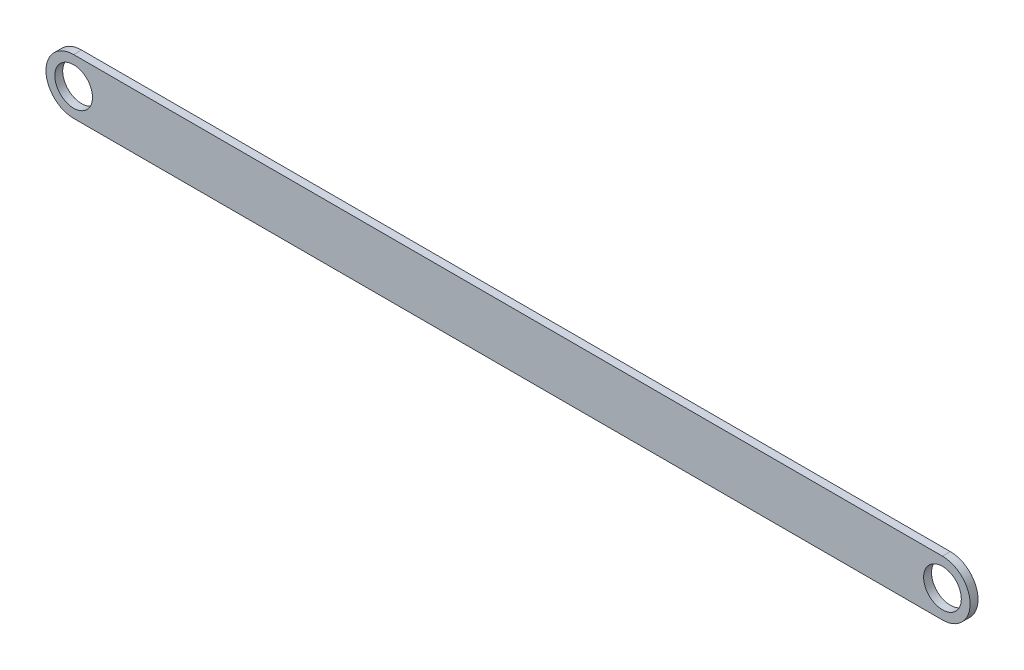
ISO-10303-21;
HEADER;
FILE_DESCRIPTION(('STEP AP214'),'2;1');
FILE_NAME('part.step','',(''),(''),'','','');
FILE_SCHEMA(('AUTOMOTIVE_DESIGN { 1 0 10303 214 1 1 1 1 }'));
ENDSEC;
DATA;
#1=APPLICATION_CONTEXT('core data for automotive mechanical design processes');
#2=APPLICATION_PROTOCOL_DEFINITION('international standard','automotive_design',2000,#1);
#3=PRODUCT_CONTEXT('',#1,'mechanical');
#4=PRODUCT('Part','Part','',(#3));
#5=PRODUCT_RELATED_PRODUCT_CATEGORY('part','',(#4));
#6=PRODUCT_DEFINITION_FORMATION('','',#4);
#7=PRODUCT_DEFINITION_CONTEXT('part definition',#1,'design');
#8=PRODUCT_DEFINITION('design','',#6,#7);
#9=PRODUCT_DEFINITION_SHAPE('','',#8);
#10=(LENGTH_UNIT() NAMED_UNIT(*) SI_UNIT(.MILLI.,.METRE.));
#11=(NAMED_UNIT(*) PLANE_ANGLE_UNIT() SI_UNIT($,.RADIAN.));
#12=(NAMED_UNIT(*) SI_UNIT($,.STERADIAN.) SOLID_ANGLE_UNIT());
#13=UNCERTAINTY_MEASURE_WITH_UNIT(LENGTH_MEASURE(1.E-05),#10,'distance_accuracy_value','');
#14=(GEOMETRIC_REPRESENTATION_CONTEXT(3) GLOBAL_UNCERTAINTY_ASSIGNED_CONTEXT((#13)) GLOBAL_UNIT_ASSIGNED_CONTEXT((#10,
#11,#12)) REPRESENTATION_CONTEXT('',''));
#15=CARTESIAN_POINT('',(0.,0.,0.));
#16=DIRECTION('',(0.,0.,1.));
#17=DIRECTION('',(1.,0.,0.));
#18=AXIS2_PLACEMENT_3D('',#15,#16,#17);
#19=CARTESIAN_POINT('',(0.,0.,4.));
#20=DIRECTION('',(0.,0.,1.));
#21=DIRECTION('',(1.,0.,0.));
#22=AXIS2_PLACEMENT_3D('',#19,#20,#21);
#23=PLANE('',#22);
#24=CARTESIAN_POINT('',(0.,0.,4.));
#25=DIRECTION('',(0.,0.,1.));
#26=DIRECTION('',(1.,0.,0.));
#27=AXIS2_PLACEMENT_3D('',#24,#25,#26);
#28=CIRCLE('',#27,9.54);
#29=CARTESIAN_POINT('',(9.54,0.,4.));
#30=VERTEX_POINT('',#29);
#31=EDGE_CURVE('E112',#30,#30,#28,.T.);
#32=ORIENTED_EDGE('',*,*,#31,.F.);
#33=EDGE_LOOP('',(#32));
#34=FACE_BOUND('',#33,.T.);
#35=CARTESIAN_POINT('',(0.,0.,4.));
#36=DIRECTION('',(0.,0.,1.));
#37=DIRECTION('',(1.,0.,0.));
#38=AXIS2_PLACEMENT_3D('',#35,#36,#37);
#39=CIRCLE('',#38,14.);
#40=CARTESIAN_POINT('',(0.,14.,4.));
#41=VERTEX_POINT('',#40);
#42=CARTESIAN_POINT('',(0.,-14.,4.));
#43=VERTEX_POINT('',#42);
#44=EDGE_CURVE('E92',#41,#43,#39,.T.);
#45=ORIENTED_EDGE('',*,*,#44,.T.);
#46=DIRECTION('',(1.,0.,0.));
#47=VECTOR('',#46,1.);
#48=CARTESIAN_POINT('',(440.,-14.,4.));
#49=LINE('',#48,#47);
#50=CARTESIAN_POINT('',(440.,-14.,4.));
#51=VERTEX_POINT('',#50);
#52=EDGE_CURVE('E87',#43,#51,#49,.T.);
#53=ORIENTED_EDGE('',*,*,#52,.T.);
#54=CARTESIAN_POINT('',(440.,0.,4.));
#55=DIRECTION('',(0.,0.,1.));
#56=DIRECTION('',(-1.,0.,0.));
#57=AXIS2_PLACEMENT_3D('',#54,#55,#56);
#58=CIRCLE('',#57,14.);
#59=CARTESIAN_POINT('',(440.,14.,4.));
#60=VERTEX_POINT('',#59);
#61=EDGE_CURVE('E90',#51,#60,#58,.T.);
#62=ORIENTED_EDGE('',*,*,#61,.T.);
#63=DIRECTION('',(-1.,0.,0.));
#64=VECTOR('',#63,1.);
#65=CARTESIAN_POINT('',(0.,14.,4.));
#66=LINE('',#65,#64);
#67=EDGE_CURVE('E57',#60,#41,#66,.T.);
#68=ORIENTED_EDGE('',*,*,#67,.T.);
#69=EDGE_LOOP('',(#45,#53,#62,#68));
#70=FACE_BOUND('',#69,.T.);
#71=CARTESIAN_POINT('',(440.,0.,4.));
#72=DIRECTION('',(0.,0.,1.));
#73=DIRECTION('',(1.,0.,0.));
#74=AXIS2_PLACEMENT_3D('',#71,#72,#73);
#75=CIRCLE('',#74,9.53999999999999);
#76=CARTESIAN_POINT('',(449.54,0.,4.));
#77=VERTEX_POINT('',#76);
#78=EDGE_CURVE('E134',#77,#77,#75,.T.);
#79=ORIENTED_EDGE('',*,*,#78,.F.);
#80=EDGE_LOOP('',(#79));
#81=FACE_BOUND('',#80,.T.);
#82=ADVANCED_FACE('F39',(#34,#70,#81),#23,.T.);
#83=CARTESIAN_POINT('',(0.,0.,0.));
#84=DIRECTION('',(0.,0.,1.));
#85=DIRECTION('',(1.,0.,0.));
#86=AXIS2_PLACEMENT_3D('',#83,#84,#85);
#87=PLANE('',#86);
#88=CARTESIAN_POINT('',(0.,0.,0.));
#89=DIRECTION('',(0.,0.,1.));
#90=DIRECTION('',(1.,0.,0.));
#91=AXIS2_PLACEMENT_3D('',#88,#89,#90);
#92=CIRCLE('',#91,14.);
#93=CARTESIAN_POINT('',(0.,14.,0.));
#94=VERTEX_POINT('',#93);
#95=CARTESIAN_POINT('',(0.,-14.,0.));
#96=VERTEX_POINT('',#95);
#97=EDGE_CURVE('E108',#94,#96,#92,.T.);
#98=ORIENTED_EDGE('',*,*,#97,.F.);
#99=DIRECTION('',(-1.,0.,0.));
#100=VECTOR('',#99,1.);
#101=CARTESIAN_POINT('',(0.,14.,0.));
#102=LINE('',#101,#100);
#103=CARTESIAN_POINT('',(440.,14.,0.));
#104=VERTEX_POINT('',#103);
#105=EDGE_CURVE('E80',#104,#94,#102,.T.);
#106=ORIENTED_EDGE('',*,*,#105,.F.);
#107=CARTESIAN_POINT('',(440.,0.,0.));
#108=DIRECTION('',(0.,0.,1.));
#109=DIRECTION('',(-1.,0.,0.));
#110=AXIS2_PLACEMENT_3D('',#107,#108,#109);
#111=CIRCLE('',#110,14.);
#112=CARTESIAN_POINT('',(440.,-14.,0.));
#113=VERTEX_POINT('',#112);
#114=EDGE_CURVE('E74',#113,#104,#111,.T.);
#115=ORIENTED_EDGE('',*,*,#114,.F.);
#116=DIRECTION('',(1.,0.,0.));
#117=VECTOR('',#116,1.);
#118=CARTESIAN_POINT('',(440.,-14.,0.));
#119=LINE('',#118,#117);
#120=EDGE_CURVE('E97',#96,#113,#119,.T.);
#121=ORIENTED_EDGE('',*,*,#120,.F.);
#122=EDGE_LOOP('',(#98,#106,#115,#121));
#123=FACE_BOUND('',#122,.T.);
#124=CARTESIAN_POINT('',(0.,0.,0.));
#125=DIRECTION('',(0.,0.,1.));
#126=DIRECTION('',(1.,0.,0.));
#127=AXIS2_PLACEMENT_3D('',#124,#125,#126);
#128=CIRCLE('',#127,9.54);
#129=CARTESIAN_POINT('',(9.54,0.,0.));
#130=VERTEX_POINT('',#129);
#131=EDGE_CURVE('E130',#130,#130,#128,.T.);
#132=ORIENTED_EDGE('',*,*,#131,.T.);
#133=EDGE_LOOP('',(#132));
#134=FACE_BOUND('',#133,.T.);
#135=CARTESIAN_POINT('',(440.,0.,0.));
#136=DIRECTION('',(0.,0.,1.));
#137=DIRECTION('',(1.,0.,0.));
#138=AXIS2_PLACEMENT_3D('',#135,#136,#137);
#139=CIRCLE('',#138,9.53999999999999);
#140=CARTESIAN_POINT('',(449.54,0.,0.));
#141=VERTEX_POINT('',#140);
#142=EDGE_CURVE('E138',#141,#141,#139,.T.);
#143=ORIENTED_EDGE('',*,*,#142,.T.);
#144=EDGE_LOOP('',(#143));
#145=FACE_BOUND('',#144,.T.);
#146=ADVANCED_FACE('F125',(#123,#134,#145),#87,.F.);
#147=CARTESIAN_POINT('',(0.,0.,4.));
#148=DIRECTION('',(0.,0.,-1.));
#149=DIRECTION('',(-1.,0.,0.));
#150=AXIS2_PLACEMENT_3D('',#147,#148,#149);
#151=CYLINDRICAL_SURFACE('',#150,14.);
#152=ORIENTED_EDGE('',*,*,#97,.T.);
#153=DIRECTION('',(0.,0.,-1.));
#154=VECTOR('',#153,1.);
#155=CARTESIAN_POINT('',(0.,-14.,4.));
#156=LINE('',#155,#154);
#157=EDGE_CURVE('E11',#43,#96,#156,.T.);
#158=ORIENTED_EDGE('',*,*,#157,.F.);
#159=ORIENTED_EDGE('',*,*,#44,.F.);
#160=DIRECTION('',(0.,0.,-1.));
#161=VECTOR('',#160,1.);
#162=CARTESIAN_POINT('',(0.,14.,4.));
#163=LINE('',#162,#161);
#164=EDGE_CURVE('E104',#41,#94,#163,.T.);
#165=ORIENTED_EDGE('',*,*,#164,.T.);
#166=EDGE_LOOP('',(#152,#158,#159,#165));
#167=FACE_BOUND('',#166,.T.);
#168=ADVANCED_FACE('F41',(#167),#151,.T.);
#169=CARTESIAN_POINT('',(440.,-14.,4.));
#170=DIRECTION('',(0.,1.,0.));
#171=DIRECTION('',(-1.,0.,0.));
#172=AXIS2_PLACEMENT_3D('',#169,#170,#171);
#173=PLANE('',#172);
#174=ORIENTED_EDGE('',*,*,#120,.T.);
#175=DIRECTION('',(0.,0.,-1.));
#176=VECTOR('',#175,1.);
#177=CARTESIAN_POINT('',(440.,-14.,4.));
#178=LINE('',#177,#176);
#179=EDGE_CURVE('E49',#51,#113,#178,.T.);
#180=ORIENTED_EDGE('',*,*,#179,.F.);
#181=ORIENTED_EDGE('',*,*,#52,.F.);
#182=ORIENTED_EDGE('',*,*,#157,.T.);
#183=EDGE_LOOP('',(#174,#180,#181,#182));
#184=FACE_BOUND('',#183,.T.);
#185=ADVANCED_FACE('F96',(#184),#173,.F.);
#186=CARTESIAN_POINT('',(440.,0.,4.));
#187=DIRECTION('',(0.,0.,-1.));
#188=DIRECTION('',(-1.,0.,0.));
#189=AXIS2_PLACEMENT_3D('',#186,#187,#188);
#190=CYLINDRICAL_SURFACE('',#189,14.);
#191=ORIENTED_EDGE('',*,*,#114,.T.);
#192=DIRECTION('',(0.,0.,-1.));
#193=VECTOR('',#192,1.);
#194=CARTESIAN_POINT('',(440.,14.,4.));
#195=LINE('',#194,#193);
#196=EDGE_CURVE('E99',#60,#104,#195,.T.);
#197=ORIENTED_EDGE('',*,*,#196,.F.);
#198=ORIENTED_EDGE('',*,*,#61,.F.);
#199=ORIENTED_EDGE('',*,*,#179,.T.);
#200=EDGE_LOOP('',(#191,#197,#198,#199));
#201=FACE_BOUND('',#200,.T.);
#202=ADVANCED_FACE('F100',(#201),#190,.T.);
#203=CARTESIAN_POINT('',(0.,14.,4.));
#204=DIRECTION('',(0.,-1.,0.));
#205=DIRECTION('',(1.,0.,0.));
#206=AXIS2_PLACEMENT_3D('',#203,#204,#205);
#207=PLANE('',#206);
#208=ORIENTED_EDGE('',*,*,#105,.T.);
#209=ORIENTED_EDGE('',*,*,#164,.F.);
#210=ORIENTED_EDGE('',*,*,#67,.F.);
#211=ORIENTED_EDGE('',*,*,#196,.T.);
#212=EDGE_LOOP('',(#208,#209,#210,#211));
#213=FACE_BOUND('',#212,.T.);
#214=ADVANCED_FACE('F122',(#213),#207,.F.);
#215=CARTESIAN_POINT('',(0.,0.,4.));
#216=DIRECTION('',(0.,0.,-1.));
#217=DIRECTION('',(-1.,0.,0.));
#218=AXIS2_PLACEMENT_3D('',#215,#216,#217);
#219=CYLINDRICAL_SURFACE('',#218,9.54);
#220=ORIENTED_EDGE('',*,*,#31,.T.);
#221=EDGE_LOOP('',(#220));
#222=FACE_BOUND('',#221,.T.);
#223=ORIENTED_EDGE('',*,*,#131,.F.);
#224=EDGE_LOOP('',(#223));
#225=FACE_BOUND('',#224,.T.);
#226=ADVANCED_FACE('F157',(#222,#225),#219,.F.);
#227=CARTESIAN_POINT('',(440.,0.,4.));
#228=DIRECTION('',(0.,0.,-1.));
#229=DIRECTION('',(-1.,0.,0.));
#230=AXIS2_PLACEMENT_3D('',#227,#228,#229);
#231=CYLINDRICAL_SURFACE('',#230,9.53999999999999);
#232=ORIENTED_EDGE('',*,*,#78,.T.);
#233=EDGE_LOOP('',(#232));
#234=FACE_BOUND('',#233,.T.);
#235=ORIENTED_EDGE('',*,*,#142,.F.);
#236=EDGE_LOOP('',(#235));
#237=FACE_BOUND('',#236,.T.);
#238=ADVANCED_FACE('F146',(#234,#237),#231,.F.);
#239=CLOSED_SHELL('',(#82,#146,#168,#185,#202,#214,#226,#238));
#240=MANIFOLD_SOLID_BREP('B2',#239);
#241=ADVANCED_BREP_SHAPE_REPRESENTATION('',(#18,#240),#14);
#242=SHAPE_DEFINITION_REPRESENTATION(#9,#241);
ENDSEC;
END-ISO-10303-21;
